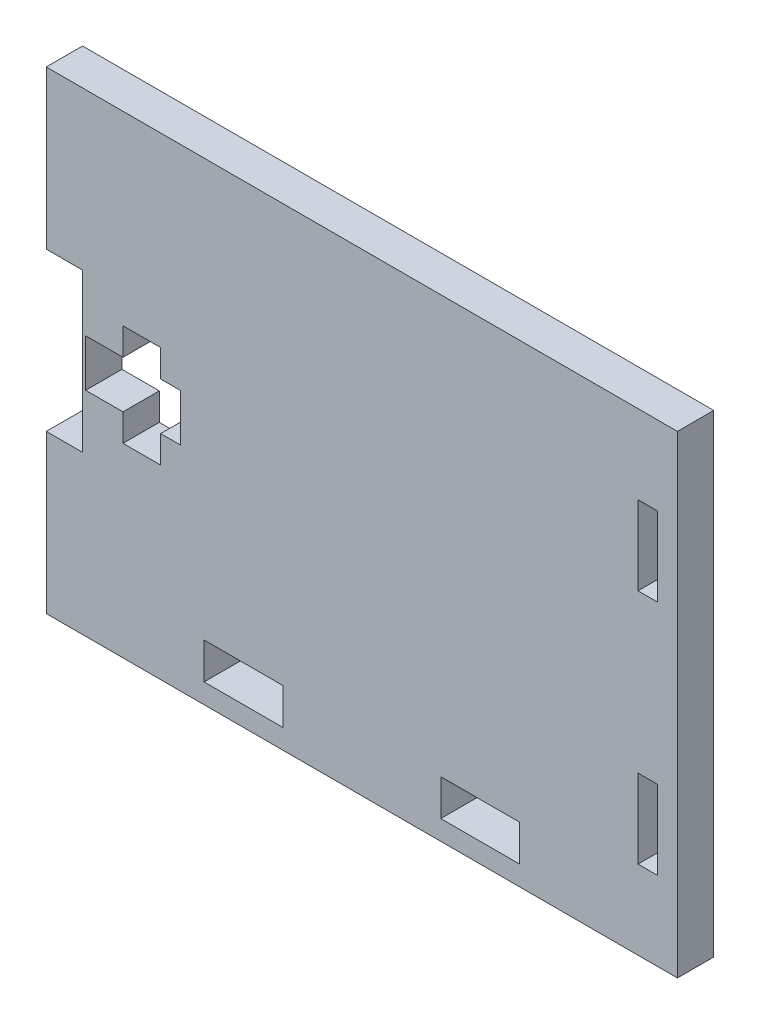
ISO-10303-21;
HEADER;
FILE_DESCRIPTION(('STEP AP214'),'2;1');
FILE_NAME('part.step','',(''),(''),'','','');
FILE_SCHEMA(('AUTOMOTIVE_DESIGN { 1 0 10303 214 1 1 1 1 }'));
ENDSEC;
DATA;
#1=APPLICATION_CONTEXT('core data for automotive mechanical design processes');
#2=APPLICATION_PROTOCOL_DEFINITION('international standard','automotive_design',2000,#1);
#3=PRODUCT_CONTEXT('',#1,'mechanical');
#4=PRODUCT('Part','Part','',(#3));
#5=PRODUCT_RELATED_PRODUCT_CATEGORY('part','',(#4));
#6=PRODUCT_DEFINITION_FORMATION('','',#4);
#7=PRODUCT_DEFINITION_CONTEXT('part definition',#1,'design');
#8=PRODUCT_DEFINITION('design','',#6,#7);
#9=PRODUCT_DEFINITION_SHAPE('','',#8);
#10=(LENGTH_UNIT() NAMED_UNIT(*) SI_UNIT(.MILLI.,.METRE.));
#11=(NAMED_UNIT(*) PLANE_ANGLE_UNIT() SI_UNIT($,.RADIAN.));
#12=(NAMED_UNIT(*) SI_UNIT($,.STERADIAN.) SOLID_ANGLE_UNIT());
#13=UNCERTAINTY_MEASURE_WITH_UNIT(LENGTH_MEASURE(1.E-05),#10,'distance_accuracy_value','');
#14=(GEOMETRIC_REPRESENTATION_CONTEXT(3) GLOBAL_UNCERTAINTY_ASSIGNED_CONTEXT((#13)) GLOBAL_UNIT_ASSIGNED_CONTEXT((#10,
#11,#12)) REPRESENTATION_CONTEXT('',''));
#15=CARTESIAN_POINT('',(0.,0.,0.));
#16=DIRECTION('',(0.,0.,1.));
#17=DIRECTION('',(1.,0.,0.));
#18=AXIS2_PLACEMENT_3D('',#15,#16,#17);
#19=CARTESIAN_POINT('',(0.,0.,-2.921));
#20=DIRECTION('',(0.,0.,-1.));
#21=DIRECTION('',(-1.,0.,0.));
#22=AXIS2_PLACEMENT_3D('',#19,#20,#21);
#23=PLANE('',#22);
#24=DIRECTION('',(0.,1.,0.));
#25=VECTOR('',#24,1.);
#26=CARTESIAN_POINT('',(49.2125,11.1125,-2.921));
#27=LINE('',#26,#25);
#28=CARTESIAN_POINT('',(49.2125,4.7625,-2.921));
#29=VERTEX_POINT('',#28);
#30=CARTESIAN_POINT('',(49.2125,11.1125,-2.921));
#31=VERTEX_POINT('',#30);
#32=EDGE_CURVE('E272',#29,#31,#27,.T.);
#33=ORIENTED_EDGE('',*,*,#32,.T.);
#34=DIRECTION('',(-1.,0.,0.));
#35=VECTOR('',#34,1.);
#36=CARTESIAN_POINT('',(49.2125,11.1125,-2.921));
#37=LINE('',#36,#35);
#38=CARTESIAN_POINT('',(47.625,11.1125,-2.921));
#39=VERTEX_POINT('',#38);
#40=EDGE_CURVE('E281',#31,#39,#37,.T.);
#41=ORIENTED_EDGE('',*,*,#40,.T.);
#42=DIRECTION('',(0.,-1.,0.));
#43=VECTOR('',#42,1.);
#44=CARTESIAN_POINT('',(47.625,11.1125,-2.921));
#45=LINE('',#44,#43);
#46=CARTESIAN_POINT('',(47.625,4.7625,-2.921));
#47=VERTEX_POINT('',#46);
#48=EDGE_CURVE('E52',#39,#47,#45,.T.);
#49=ORIENTED_EDGE('',*,*,#48,.T.);
#50=DIRECTION('',(1.,0.,0.));
#51=VECTOR('',#50,1.);
#52=CARTESIAN_POINT('',(49.2125,4.7625,-2.921));
#53=LINE('',#52,#51);
#54=EDGE_CURVE('E278',#47,#29,#53,.T.);
#55=ORIENTED_EDGE('',*,*,#54,.T.);
#56=EDGE_LOOP('',(#33,#41,#49,#55));
#57=FACE_BOUND('',#56,.T.);
#58=DIRECTION('',(0.,-1.,0.));
#59=VECTOR('',#58,1.);
#60=CARTESIAN_POINT('',(47.625,30.1625,-2.921));
#61=LINE('',#60,#59);
#62=CARTESIAN_POINT('',(47.625,30.1625,-2.921));
#63=VERTEX_POINT('',#62);
#64=CARTESIAN_POINT('',(47.625,23.8125,-2.921));
#65=VERTEX_POINT('',#64);
#66=EDGE_CURVE('E314',#63,#65,#61,.T.);
#67=ORIENTED_EDGE('',*,*,#66,.T.);
#68=DIRECTION('',(1.,0.,0.));
#69=VECTOR('',#68,1.);
#70=CARTESIAN_POINT('',(47.625,23.8125,-2.921));
#71=LINE('',#70,#69);
#72=CARTESIAN_POINT('',(49.2125,23.8125,-2.921));
#73=VERTEX_POINT('',#72);
#74=EDGE_CURVE('E317',#65,#73,#71,.T.);
#75=ORIENTED_EDGE('',*,*,#74,.T.);
#76=DIRECTION('',(0.,1.,0.));
#77=VECTOR('',#76,1.);
#78=CARTESIAN_POINT('',(49.2125,30.1625,-2.921));
#79=LINE('',#78,#77);
#80=CARTESIAN_POINT('',(49.2125,30.1625,-2.921));
#81=VERTEX_POINT('',#80);
#82=EDGE_CURVE('E321',#73,#81,#79,.T.);
#83=ORIENTED_EDGE('',*,*,#82,.T.);
#84=DIRECTION('',(-1.,0.,0.));
#85=VECTOR('',#84,1.);
#86=CARTESIAN_POINT('',(47.625,30.1625,-2.921));
#87=LINE('',#86,#85);
#88=EDGE_CURVE('E324',#81,#63,#87,.T.);
#89=ORIENTED_EDGE('',*,*,#88,.T.);
#90=EDGE_LOOP('',(#67,#75,#83,#89));
#91=FACE_BOUND('',#90,.T.);
#92=DIRECTION('',(0.,1.,0.));
#93=VECTOR('',#92,1.);
#94=CARTESIAN_POINT('',(19.05,0.,-2.921));
#95=LINE('',#94,#93);
#96=CARTESIAN_POINT('',(19.05,0.,-2.921));
#97=VERTEX_POINT('',#96);
#98=CARTESIAN_POINT('',(19.05,2.921,-2.921));
#99=VERTEX_POINT('',#98);
#100=EDGE_CURVE('E553',#97,#99,#95,.T.);
#101=ORIENTED_EDGE('',*,*,#100,.T.);
#102=DIRECTION('',(-1.,0.,0.));
#103=VECTOR('',#102,1.);
#104=CARTESIAN_POINT('',(19.05,2.921,-2.921));
#105=LINE('',#104,#103);
#106=CARTESIAN_POINT('',(12.7,2.921,-2.921));
#107=VERTEX_POINT('',#106);
#108=EDGE_CURVE('E556',#99,#107,#105,.T.);
#109=ORIENTED_EDGE('',*,*,#108,.T.);
#110=DIRECTION('',(0.,-1.,0.));
#111=VECTOR('',#110,1.);
#112=CARTESIAN_POINT('',(12.7,2.921,-2.921));
#113=LINE('',#112,#111);
#114=CARTESIAN_POINT('',(12.7,0.,-2.921));
#115=VERTEX_POINT('',#114);
#116=EDGE_CURVE('E559',#107,#115,#113,.T.);
#117=ORIENTED_EDGE('',*,*,#116,.T.);
#118=DIRECTION('',(1.,0.,0.));
#119=VECTOR('',#118,1.);
#120=CARTESIAN_POINT('',(12.7,0.,-2.921));
#121=LINE('',#120,#119);
#122=EDGE_CURVE('E561',#115,#97,#121,.T.);
#123=ORIENTED_EDGE('',*,*,#122,.T.);
#124=EDGE_LOOP('',(#101,#109,#117,#123));
#125=FACE_BOUND('',#124,.T.);
#126=DIRECTION('',(0.,1.,0.));
#127=VECTOR('',#126,1.);
#128=CARTESIAN_POINT('',(38.1,0.,-2.921));
#129=LINE('',#128,#127);
#130=CARTESIAN_POINT('',(38.1,0.,-2.921));
#131=VERTEX_POINT('',#130);
#132=CARTESIAN_POINT('',(38.1,2.921,-2.921));
#133=VERTEX_POINT('',#132);
#134=EDGE_CURVE('E542',#131,#133,#129,.T.);
#135=ORIENTED_EDGE('',*,*,#134,.T.);
#136=DIRECTION('',(-1.,0.,0.));
#137=VECTOR('',#136,1.);
#138=CARTESIAN_POINT('',(38.1,2.921,-2.921));
#139=LINE('',#138,#137);
#140=CARTESIAN_POINT('',(31.75,2.921,-2.921));
#141=VERTEX_POINT('',#140);
#142=EDGE_CURVE('E632',#133,#141,#139,.T.);
#143=ORIENTED_EDGE('',*,*,#142,.T.);
#144=DIRECTION('',(0.,-1.,0.));
#145=VECTOR('',#144,1.);
#146=CARTESIAN_POINT('',(31.75,2.921,-2.921));
#147=LINE('',#146,#145);
#148=CARTESIAN_POINT('',(31.75,0.,-2.921));
#149=VERTEX_POINT('',#148);
#150=EDGE_CURVE('E635',#141,#149,#147,.T.);
#151=ORIENTED_EDGE('',*,*,#150,.T.);
#152=DIRECTION('',(1.,0.,0.));
#153=VECTOR('',#152,1.);
#154=CARTESIAN_POINT('',(31.75,0.,-2.921));
#155=LINE('',#154,#153);
#156=EDGE_CURVE('E552',#149,#131,#155,.T.);
#157=ORIENTED_EDGE('',*,*,#156,.T.);
#158=EDGE_LOOP('',(#135,#143,#151,#157));
#159=FACE_BOUND('',#158,.T.);
#160=DIRECTION('',(-1.,0.,0.));
#161=VECTOR('',#160,1.);
#162=CARTESIAN_POINT('',(-4.43491996680027,23.8125,-2.921));
#163=LINE('',#162,#161);
#164=CARTESIAN_POINT('',(2.921,23.8125,-2.921));
#165=VERTEX_POINT('',#164);
#166=CARTESIAN_POINT('',(0.,23.8125,-2.921));
#167=VERTEX_POINT('',#166);
#168=EDGE_CURVE('E467',#165,#167,#163,.T.);
#169=ORIENTED_EDGE('',*,*,#168,.T.);
#170=DIRECTION('',(0.,-1.,0.));
#171=VECTOR('',#170,1.);
#172=CARTESIAN_POINT('',(0.,-1.5875,-2.921));
#173=LINE('',#172,#171);
#174=CARTESIAN_POINT('',(0.,36.5125,-2.921));
#175=VERTEX_POINT('',#174);
#176=EDGE_CURVE('E576',#175,#167,#173,.T.);
#177=ORIENTED_EDGE('',*,*,#176,.F.);
#178=DIRECTION('',(-1.,0.,0.));
#179=VECTOR('',#178,1.);
#180=CARTESIAN_POINT('',(0.,36.5125,-2.921));
#181=LINE('',#180,#179);
#182=CARTESIAN_POINT('',(50.8,36.5125,-2.921));
#183=VERTEX_POINT('',#182);
#184=EDGE_CURVE('E490',#183,#175,#181,.T.);
#185=ORIENTED_EDGE('',*,*,#184,.F.);
#186=DIRECTION('',(0.,1.,0.));
#187=VECTOR('',#186,1.);
#188=CARTESIAN_POINT('',(50.8,-1.5875,-2.921));
#189=LINE('',#188,#187);
#190=CARTESIAN_POINT('',(50.8,-1.5875,-2.921));
#191=VERTEX_POINT('',#190);
#192=EDGE_CURVE('E582',#191,#183,#189,.T.);
#193=ORIENTED_EDGE('',*,*,#192,.F.);
#194=DIRECTION('',(1.,0.,0.));
#195=VECTOR('',#194,1.);
#196=CARTESIAN_POINT('',(0.,-1.5875,-2.921));
#197=LINE('',#196,#195);
#198=CARTESIAN_POINT('',(0.,-1.5875,-2.921));
#199=VERTEX_POINT('',#198);
#200=EDGE_CURVE('E579',#199,#191,#197,.T.);
#201=ORIENTED_EDGE('',*,*,#200,.F.);
#202=CARTESIAN_POINT('',(0.,11.1125,-2.921));
#203=VERTEX_POINT('',#202);
#204=EDGE_CURVE('E580',#203,#199,#173,.T.);
#205=ORIENTED_EDGE('',*,*,#204,.F.);
#206=DIRECTION('',(1.,0.,0.));
#207=VECTOR('',#206,1.);
#208=CARTESIAN_POINT('',(2.921,11.1125,-2.921));
#209=LINE('',#208,#207);
#210=CARTESIAN_POINT('',(2.921,11.1125,-2.921));
#211=VERTEX_POINT('',#210);
#212=EDGE_CURVE('E460',#203,#211,#209,.T.);
#213=ORIENTED_EDGE('',*,*,#212,.T.);
#214=DIRECTION('',(0.,1.,0.));
#215=VECTOR('',#214,1.);
#216=CARTESIAN_POINT('',(2.921,23.8125,-2.921));
#217=LINE('',#216,#215);
#218=EDGE_CURVE('E463',#211,#165,#217,.T.);
#219=ORIENTED_EDGE('',*,*,#218,.T.);
#220=EDGE_LOOP('',(#169,#177,#185,#193,#201,#205,#213,#219));
#221=FACE_BOUND('',#220,.T.);
#222=DIRECTION('',(0.,-1.,0.));
#223=VECTOR('',#222,1.);
#224=CARTESIAN_POINT('',(10.795,19.36115,-2.921));
#225=LINE('',#224,#223);
#226=CARTESIAN_POINT('',(10.795,19.36115,-2.921));
#227=VERTEX_POINT('',#226);
#228=CARTESIAN_POINT('',(10.795,15.56385,-2.921));
#229=VERTEX_POINT('',#228);
#230=EDGE_CURVE('E354',#227,#229,#225,.T.);
#231=ORIENTED_EDGE('',*,*,#230,.F.);
#232=DIRECTION('',(1.,0.,0.));
#233=VECTOR('',#232,1.);
#234=CARTESIAN_POINT('',(9.2075,19.36115,-2.921));
#235=LINE('',#234,#233);
#236=CARTESIAN_POINT('',(9.2075,19.36115,-2.921));
#237=VERTEX_POINT('',#236);
#238=EDGE_CURVE('E352',#237,#227,#235,.T.);
#239=ORIENTED_EDGE('',*,*,#238,.F.);
#240=DIRECTION('',(0.,-1.,0.));
#241=VECTOR('',#240,1.);
#242=CARTESIAN_POINT('',(9.2075,21.55825,-2.921));
#243=LINE('',#242,#241);
#244=CARTESIAN_POINT('',(9.2075,21.55825,-2.921));
#245=VERTEX_POINT('',#244);
#246=EDGE_CURVE('E376',#245,#237,#243,.T.);
#247=ORIENTED_EDGE('',*,*,#246,.F.);
#248=DIRECTION('',(1.,0.,0.));
#249=VECTOR('',#248,1.);
#250=CARTESIAN_POINT('',(6.175375,21.55825,-2.921));
#251=LINE('',#250,#249);
#252=CARTESIAN_POINT('',(6.175375,21.55825,-2.921));
#253=VERTEX_POINT('',#252);
#254=EDGE_CURVE('E373',#253,#245,#251,.T.);
#255=ORIENTED_EDGE('',*,*,#254,.F.);
#256=DIRECTION('',(0.,1.,0.));
#257=VECTOR('',#256,1.);
#258=CARTESIAN_POINT('',(6.175375,19.36115,-2.921));
#259=LINE('',#258,#257);
#260=CARTESIAN_POINT('',(6.175375,19.36115,-2.921));
#261=VERTEX_POINT('',#260);
#262=EDGE_CURVE('E371',#261,#253,#259,.T.);
#263=ORIENTED_EDGE('',*,*,#262,.F.);
#264=DIRECTION('',(1.,0.,0.));
#265=VECTOR('',#264,1.);
#266=CARTESIAN_POINT('',(3.175,19.36115,-2.921));
#267=LINE('',#266,#265);
#268=CARTESIAN_POINT('',(3.175,19.36115,-2.921));
#269=VERTEX_POINT('',#268);
#270=EDGE_CURVE('E369',#269,#261,#267,.T.);
#271=ORIENTED_EDGE('',*,*,#270,.F.);
#272=DIRECTION('',(0.,1.,0.));
#273=VECTOR('',#272,1.);
#274=CARTESIAN_POINT('',(3.175,15.56385,-2.921));
#275=LINE('',#274,#273);
#276=CARTESIAN_POINT('',(3.175,15.56385,-2.921));
#277=VERTEX_POINT('',#276);
#278=EDGE_CURVE('E367',#277,#269,#275,.T.);
#279=ORIENTED_EDGE('',*,*,#278,.F.);
#280=DIRECTION('',(-1.,0.,0.));
#281=VECTOR('',#280,1.);
#282=CARTESIAN_POINT('',(6.175375,15.56385,-2.921));
#283=LINE('',#282,#281);
#284=CARTESIAN_POINT('',(6.175375,15.56385,-2.921));
#285=VERTEX_POINT('',#284);
#286=EDGE_CURVE('E365',#285,#277,#283,.T.);
#287=ORIENTED_EDGE('',*,*,#286,.F.);
#288=DIRECTION('',(0.,1.,0.));
#289=VECTOR('',#288,1.);
#290=CARTESIAN_POINT('',(6.175375,13.36675,-2.921));
#291=LINE('',#290,#289);
#292=CARTESIAN_POINT('',(6.175375,13.36675,-2.921));
#293=VERTEX_POINT('',#292);
#294=EDGE_CURVE('E363',#293,#285,#291,.T.);
#295=ORIENTED_EDGE('',*,*,#294,.F.);
#296=DIRECTION('',(-1.,0.,0.));
#297=VECTOR('',#296,1.);
#298=CARTESIAN_POINT('',(9.2075,13.36675,-2.921));
#299=LINE('',#298,#297);
#300=CARTESIAN_POINT('',(9.2075,13.36675,-2.921));
#301=VERTEX_POINT('',#300);
#302=EDGE_CURVE('E361',#301,#293,#299,.T.);
#303=ORIENTED_EDGE('',*,*,#302,.F.);
#304=DIRECTION('',(0.,-1.,0.));
#305=VECTOR('',#304,1.);
#306=CARTESIAN_POINT('',(9.2075,15.56385,-2.921));
#307=LINE('',#306,#305);
#308=CARTESIAN_POINT('',(9.2075,15.56385,-2.921));
#309=VERTEX_POINT('',#308);
#310=EDGE_CURVE('E359',#309,#301,#307,.T.);
#311=ORIENTED_EDGE('',*,*,#310,.F.);
#312=DIRECTION('',(-1.,0.,0.));
#313=VECTOR('',#312,1.);
#314=CARTESIAN_POINT('',(10.795,15.56385,-2.921));
#315=LINE('',#314,#313);
#316=EDGE_CURVE('E357',#229,#309,#315,.T.);
#317=ORIENTED_EDGE('',*,*,#316,.F.);
#318=EDGE_LOOP('',(#231,#239,#247,#255,#263,#271,#279,#287,#295,#303,#311,#317));
#319=FACE_BOUND('',#318,.T.);
#320=ADVANCED_FACE('F36',(#57,#91,#125,#159,#221,#319),#23,.T.);
#321=CARTESIAN_POINT('',(0.,0.,0.));
#322=DIRECTION('',(0.,0.,-1.));
#323=DIRECTION('',(-1.,0.,0.));
#324=AXIS2_PLACEMENT_3D('',#321,#322,#323);
#325=PLANE('',#324);
#326=DIRECTION('',(-1.,0.,0.));
#327=VECTOR('',#326,1.);
#328=CARTESIAN_POINT('',(49.2125,11.1125,0.));
#329=LINE('',#328,#327);
#330=CARTESIAN_POINT('',(49.2125,11.1125,0.));
#331=VERTEX_POINT('',#330);
#332=CARTESIAN_POINT('',(47.625,11.1125,0.));
#333=VERTEX_POINT('',#332);
#334=EDGE_CURVE('E297',#331,#333,#329,.T.);
#335=ORIENTED_EDGE('',*,*,#334,.F.);
#336=DIRECTION('',(0.,1.,0.));
#337=VECTOR('',#336,1.);
#338=CARTESIAN_POINT('',(49.2125,11.1125,0.));
#339=LINE('',#338,#337);
#340=CARTESIAN_POINT('',(49.2125,4.7625,0.));
#341=VERTEX_POINT('',#340);
#342=EDGE_CURVE('E60',#341,#331,#339,.T.);
#343=ORIENTED_EDGE('',*,*,#342,.F.);
#344=DIRECTION('',(1.,0.,0.));
#345=VECTOR('',#344,1.);
#346=CARTESIAN_POINT('',(49.2125,4.7625,0.));
#347=LINE('',#346,#345);
#348=CARTESIAN_POINT('',(47.625,4.7625,0.));
#349=VERTEX_POINT('',#348);
#350=EDGE_CURVE('E287',#349,#341,#347,.T.);
#351=ORIENTED_EDGE('',*,*,#350,.F.);
#352=DIRECTION('',(0.,-1.,0.));
#353=VECTOR('',#352,1.);
#354=CARTESIAN_POINT('',(47.625,11.1125,0.));
#355=LINE('',#354,#353);
#356=EDGE_CURVE('E290',#333,#349,#355,.T.);
#357=ORIENTED_EDGE('',*,*,#356,.F.);
#358=EDGE_LOOP('',(#335,#343,#351,#357));
#359=FACE_BOUND('',#358,.T.);
#360=DIRECTION('',(1.,0.,0.));
#361=VECTOR('',#360,1.);
#362=CARTESIAN_POINT('',(47.625,23.8125,0.));
#363=LINE('',#362,#361);
#364=CARTESIAN_POINT('',(47.625,23.8125,0.));
#365=VERTEX_POINT('',#364);
#366=CARTESIAN_POINT('',(49.2125,23.8125,0.));
#367=VERTEX_POINT('',#366);
#368=EDGE_CURVE('E330',#365,#367,#363,.T.);
#369=ORIENTED_EDGE('',*,*,#368,.F.);
#370=DIRECTION('',(0.,-1.,0.));
#371=VECTOR('',#370,1.);
#372=CARTESIAN_POINT('',(47.625,30.1625,0.));
#373=LINE('',#372,#371);
#374=CARTESIAN_POINT('',(47.625,30.1625,0.));
#375=VERTEX_POINT('',#374);
#376=EDGE_CURVE('E310',#375,#365,#373,.T.);
#377=ORIENTED_EDGE('',*,*,#376,.F.);
#378=DIRECTION('',(-1.,0.,0.));
#379=VECTOR('',#378,1.);
#380=CARTESIAN_POINT('',(47.625,30.1625,0.));
#381=LINE('',#380,#379);
#382=CARTESIAN_POINT('',(49.2125,30.1625,0.));
#383=VERTEX_POINT('',#382);
#384=EDGE_CURVE('E318',#383,#375,#381,.T.);
#385=ORIENTED_EDGE('',*,*,#384,.F.);
#386=DIRECTION('',(0.,1.,0.));
#387=VECTOR('',#386,1.);
#388=CARTESIAN_POINT('',(49.2125,30.1625,0.));
#389=LINE('',#388,#387);
#390=EDGE_CURVE('E341',#367,#383,#389,.T.);
#391=ORIENTED_EDGE('',*,*,#390,.F.);
#392=EDGE_LOOP('',(#369,#377,#385,#391));
#393=FACE_BOUND('',#392,.T.);
#394=DIRECTION('',(0.,-1.,0.));
#395=VECTOR('',#394,1.);
#396=CARTESIAN_POINT('',(0.,-1.5875,0.));
#397=LINE('',#396,#395);
#398=CARTESIAN_POINT('',(0.,36.5125,0.));
#399=VERTEX_POINT('',#398);
#400=CARTESIAN_POINT('',(0.,23.8125,0.));
#401=VERTEX_POINT('',#400);
#402=EDGE_CURVE('E484',#399,#401,#397,.T.);
#403=ORIENTED_EDGE('',*,*,#402,.T.);
#404=DIRECTION('',(-1.,0.,0.));
#405=VECTOR('',#404,1.);
#406=CARTESIAN_POINT('',(-4.43491996680027,23.8125,0.));
#407=LINE('',#406,#405);
#408=CARTESIAN_POINT('',(2.921,23.8125,0.));
#409=VERTEX_POINT('',#408);
#410=EDGE_CURVE('E464',#409,#401,#407,.T.);
#411=ORIENTED_EDGE('',*,*,#410,.F.);
#412=DIRECTION('',(0.,1.,0.));
#413=VECTOR('',#412,1.);
#414=CARTESIAN_POINT('',(2.921,23.8125,0.));
#415=LINE('',#414,#413);
#416=CARTESIAN_POINT('',(2.921,11.1125,0.));
#417=VERTEX_POINT('',#416);
#418=EDGE_CURVE('E459',#417,#409,#415,.T.);
#419=ORIENTED_EDGE('',*,*,#418,.F.);
#420=DIRECTION('',(-1.,0.,0.));
#421=VECTOR('',#420,1.);
#422=CARTESIAN_POINT('',(0.,11.1125,0.));
#423=LINE('',#422,#421);
#424=CARTESIAN_POINT('',(0.,11.1125,0.));
#425=VERTEX_POINT('',#424);
#426=EDGE_CURVE('E12',#417,#425,#423,.T.);
#427=ORIENTED_EDGE('',*,*,#426,.T.);
#428=CARTESIAN_POINT('',(0.,-1.5875,0.));
#429=VERTEX_POINT('',#428);
#430=EDGE_CURVE('E489',#425,#429,#397,.T.);
#431=ORIENTED_EDGE('',*,*,#430,.T.);
#432=DIRECTION('',(1.,0.,0.));
#433=VECTOR('',#432,1.);
#434=CARTESIAN_POINT('',(0.,-1.5875,0.));
#435=LINE('',#434,#433);
#436=CARTESIAN_POINT('',(50.8,-1.5875,0.));
#437=VERTEX_POINT('',#436);
#438=EDGE_CURVE('E488',#429,#437,#435,.T.);
#439=ORIENTED_EDGE('',*,*,#438,.T.);
#440=DIRECTION('',(0.,1.,0.));
#441=VECTOR('',#440,1.);
#442=CARTESIAN_POINT('',(50.8,-1.5875,0.));
#443=LINE('',#442,#441);
#444=CARTESIAN_POINT('',(50.8,36.5125,0.));
#445=VERTEX_POINT('',#444);
#446=EDGE_CURVE('E496',#437,#445,#443,.T.);
#447=ORIENTED_EDGE('',*,*,#446,.T.);
#448=DIRECTION('',(-1.,0.,0.));
#449=VECTOR('',#448,1.);
#450=CARTESIAN_POINT('',(0.,36.5125,0.));
#451=LINE('',#450,#449);
#452=EDGE_CURVE('E500',#445,#399,#451,.T.);
#453=ORIENTED_EDGE('',*,*,#452,.T.);
#454=EDGE_LOOP('',(#403,#411,#419,#427,#431,#439,#447,#453));
#455=FACE_BOUND('',#454,.T.);
#456=DIRECTION('',(-1.,0.,0.));
#457=VECTOR('',#456,1.);
#458=CARTESIAN_POINT('',(19.05,2.921,0.));
#459=LINE('',#458,#457);
#460=CARTESIAN_POINT('',(19.05,2.921,0.));
#461=VERTEX_POINT('',#460);
#462=CARTESIAN_POINT('',(12.7,2.921,0.));
#463=VERTEX_POINT('',#462);
#464=EDGE_CURVE('E509',#461,#463,#459,.T.);
#465=ORIENTED_EDGE('',*,*,#464,.F.);
#466=DIRECTION('',(0.,1.,0.));
#467=VECTOR('',#466,1.);
#468=CARTESIAN_POINT('',(19.05,0.,0.));
#469=LINE('',#468,#467);
#470=CARTESIAN_POINT('',(19.05,0.,0.));
#471=VERTEX_POINT('',#470);
#472=EDGE_CURVE('E514',#471,#461,#469,.T.);
#473=ORIENTED_EDGE('',*,*,#472,.F.);
#474=DIRECTION('',(1.,0.,0.));
#475=VECTOR('',#474,1.);
#476=CARTESIAN_POINT('',(12.7,0.,0.));
#477=LINE('',#476,#475);
#478=CARTESIAN_POINT('',(12.7,0.,0.));
#479=VERTEX_POINT('',#478);
#480=EDGE_CURVE('E520',#479,#471,#477,.T.);
#481=ORIENTED_EDGE('',*,*,#480,.F.);
#482=DIRECTION('',(0.,-1.,0.));
#483=VECTOR('',#482,1.);
#484=CARTESIAN_POINT('',(12.7,2.921,0.));
#485=LINE('',#484,#483);
#486=EDGE_CURVE('E513',#463,#479,#485,.T.);
#487=ORIENTED_EDGE('',*,*,#486,.F.);
#488=EDGE_LOOP('',(#465,#473,#481,#487));
#489=FACE_BOUND('',#488,.T.);
#490=DIRECTION('',(-1.,0.,0.));
#491=VECTOR('',#490,1.);
#492=CARTESIAN_POINT('',(38.1,2.921,0.));
#493=LINE('',#492,#491);
#494=CARTESIAN_POINT('',(38.1,2.921,0.));
#495=VERTEX_POINT('',#494);
#496=CARTESIAN_POINT('',(31.75,2.921,0.));
#497=VERTEX_POINT('',#496);
#498=EDGE_CURVE('E528',#495,#497,#493,.T.);
#499=ORIENTED_EDGE('',*,*,#498,.F.);
#500=DIRECTION('',(0.,1.,0.));
#501=VECTOR('',#500,1.);
#502=CARTESIAN_POINT('',(38.1,0.,0.));
#503=LINE('',#502,#501);
#504=CARTESIAN_POINT('',(38.1,0.,0.));
#505=VERTEX_POINT('',#504);
#506=EDGE_CURVE('E532',#505,#495,#503,.T.);
#507=ORIENTED_EDGE('',*,*,#506,.F.);
#508=DIRECTION('',(1.,0.,0.));
#509=VECTOR('',#508,1.);
#510=CARTESIAN_POINT('',(31.75,0.,0.));
#511=LINE('',#510,#509);
#512=CARTESIAN_POINT('',(31.75,0.,0.));
#513=VERTEX_POINT('',#512);
#514=EDGE_CURVE('E538',#513,#505,#511,.T.);
#515=ORIENTED_EDGE('',*,*,#514,.F.);
#516=DIRECTION('',(0.,-1.,0.));
#517=VECTOR('',#516,1.);
#518=CARTESIAN_POINT('',(31.75,2.921,0.));
#519=LINE('',#518,#517);
#520=EDGE_CURVE('E531',#497,#513,#519,.T.);
#521=ORIENTED_EDGE('',*,*,#520,.F.);
#522=EDGE_LOOP('',(#499,#507,#515,#521));
#523=FACE_BOUND('',#522,.T.);
#524=DIRECTION('',(1.,0.,0.));
#525=VECTOR('',#524,1.);
#526=CARTESIAN_POINT('',(9.2075,19.36115,0.));
#527=LINE('',#526,#525);
#528=CARTESIAN_POINT('',(9.2075,19.36115,0.));
#529=VERTEX_POINT('',#528);
#530=CARTESIAN_POINT('',(10.795,19.36115,0.));
#531=VERTEX_POINT('',#530);
#532=EDGE_CURVE('E345',#529,#531,#527,.T.);
#533=ORIENTED_EDGE('',*,*,#532,.T.);
#534=DIRECTION('',(0.,-1.,0.));
#535=VECTOR('',#534,1.);
#536=CARTESIAN_POINT('',(10.795,19.36115,0.));
#537=LINE('',#536,#535);
#538=CARTESIAN_POINT('',(10.795,15.56385,0.));
#539=VERTEX_POINT('',#538);
#540=EDGE_CURVE('E382',#531,#539,#537,.T.);
#541=ORIENTED_EDGE('',*,*,#540,.T.);
#542=DIRECTION('',(-1.,0.,0.));
#543=VECTOR('',#542,1.);
#544=CARTESIAN_POINT('',(10.795,15.56385,0.));
#545=LINE('',#544,#543);
#546=CARTESIAN_POINT('',(9.2075,15.56385,0.));
#547=VERTEX_POINT('',#546);
#548=EDGE_CURVE('E394',#539,#547,#545,.T.);
#549=ORIENTED_EDGE('',*,*,#548,.T.);
#550=DIRECTION('',(0.,-1.,0.));
#551=VECTOR('',#550,1.);
#552=CARTESIAN_POINT('',(9.2075,15.56385,0.));
#553=LINE('',#552,#551);
#554=CARTESIAN_POINT('',(9.2075,13.36675,0.));
#555=VERTEX_POINT('',#554);
#556=EDGE_CURVE('E397',#547,#555,#553,.T.);
#557=ORIENTED_EDGE('',*,*,#556,.T.);
#558=DIRECTION('',(-1.,0.,0.));
#559=VECTOR('',#558,1.);
#560=CARTESIAN_POINT('',(9.2075,13.36675,0.));
#561=LINE('',#560,#559);
#562=CARTESIAN_POINT('',(6.175375,13.36675,0.));
#563=VERTEX_POINT('',#562);
#564=EDGE_CURVE('E401',#555,#563,#561,.T.);
#565=ORIENTED_EDGE('',*,*,#564,.T.);
#566=DIRECTION('',(0.,1.,0.));
#567=VECTOR('',#566,1.);
#568=CARTESIAN_POINT('',(6.175375,13.36675,0.));
#569=LINE('',#568,#567);
#570=CARTESIAN_POINT('',(6.175375,15.56385,0.));
#571=VERTEX_POINT('',#570);
#572=EDGE_CURVE('E405',#563,#571,#569,.T.);
#573=ORIENTED_EDGE('',*,*,#572,.T.);
#574=DIRECTION('',(-1.,0.,0.));
#575=VECTOR('',#574,1.);
#576=CARTESIAN_POINT('',(6.175375,15.56385,0.));
#577=LINE('',#576,#575);
#578=CARTESIAN_POINT('',(3.175,15.56385,0.));
#579=VERTEX_POINT('',#578);
#580=EDGE_CURVE('E413',#571,#579,#577,.T.);
#581=ORIENTED_EDGE('',*,*,#580,.T.);
#582=DIRECTION('',(0.,1.,0.));
#583=VECTOR('',#582,1.);
#584=CARTESIAN_POINT('',(3.175,15.56385,0.));
#585=LINE('',#584,#583);
#586=CARTESIAN_POINT('',(3.175,19.36115,0.));
#587=VERTEX_POINT('',#586);
#588=EDGE_CURVE('E416',#579,#587,#585,.T.);
#589=ORIENTED_EDGE('',*,*,#588,.T.);
#590=DIRECTION('',(1.,0.,0.));
#591=VECTOR('',#590,1.);
#592=CARTESIAN_POINT('',(3.175,19.36115,0.));
#593=LINE('',#592,#591);
#594=CARTESIAN_POINT('',(6.175375,19.36115,0.));
#595=VERTEX_POINT('',#594);
#596=EDGE_CURVE('E420',#587,#595,#593,.T.);
#597=ORIENTED_EDGE('',*,*,#596,.T.);
#598=DIRECTION('',(0.,1.,0.));
#599=VECTOR('',#598,1.);
#600=CARTESIAN_POINT('',(6.175375,19.36115,0.));
#601=LINE('',#600,#599);
#602=CARTESIAN_POINT('',(6.175375,21.55825,0.));
#603=VERTEX_POINT('',#602);
#604=EDGE_CURVE('E424',#595,#603,#601,.T.);
#605=ORIENTED_EDGE('',*,*,#604,.T.);
#606=DIRECTION('',(1.,0.,0.));
#607=VECTOR('',#606,1.);
#608=CARTESIAN_POINT('',(6.175375,21.55825,0.));
#609=LINE('',#608,#607);
#610=CARTESIAN_POINT('',(9.2075,21.55825,0.));
#611=VERTEX_POINT('',#610);
#612=EDGE_CURVE('E428',#603,#611,#609,.T.);
#613=ORIENTED_EDGE('',*,*,#612,.T.);
#614=DIRECTION('',(0.,-1.,0.));
#615=VECTOR('',#614,1.);
#616=CARTESIAN_POINT('',(9.2075,21.55825,0.));
#617=LINE('',#616,#615);
#618=EDGE_CURVE('E355',#611,#529,#617,.T.);
#619=ORIENTED_EDGE('',*,*,#618,.T.);
#620=EDGE_LOOP('',(#533,#541,#549,#557,#565,#573,#581,#589,#597,#605,#613,#619));
#621=FACE_BOUND('',#620,.T.);
#622=ADVANCED_FACE('F610',(#359,#393,#455,#489,#523,#621),#325,.F.);
#623=CARTESIAN_POINT('',(0.,-1.5875,-2.921));
#624=DIRECTION('',(-1.,0.,0.));
#625=DIRECTION('',(0.,0.,1.));
#626=AXIS2_PLACEMENT_3D('',#623,#624,#625);
#627=PLANE('',#626);
#628=DIRECTION('',(0.,0.,-1.));
#629=VECTOR('',#628,1.);
#630=CARTESIAN_POINT('',(0.,23.8125,-2.921));
#631=LINE('',#630,#629);
#632=EDGE_CURVE('E607',#401,#167,#631,.T.);
#633=ORIENTED_EDGE('',*,*,#632,.F.);
#634=ORIENTED_EDGE('',*,*,#402,.F.);
#635=DIRECTION('',(0.,0.,1.));
#636=VECTOR('',#635,1.);
#637=CARTESIAN_POINT('',(0.,36.5125,-2.921));
#638=LINE('',#637,#636);
#639=EDGE_CURVE('E45',#175,#399,#638,.T.);
#640=ORIENTED_EDGE('',*,*,#639,.F.);
#641=ORIENTED_EDGE('',*,*,#176,.T.);
#642=EDGE_LOOP('',(#633,#634,#640,#641));
#643=FACE_BOUND('',#642,.T.);
#644=ADVANCED_FACE('F606',(#643),#627,.T.);
#645=DIRECTION('',(0.,0.,1.));
#646=VECTOR('',#645,1.);
#647=CARTESIAN_POINT('',(0.,11.1125,-2.921));
#648=LINE('',#647,#646);
#649=EDGE_CURVE('E615',#203,#425,#648,.T.);
#650=ORIENTED_EDGE('',*,*,#649,.F.);
#651=ORIENTED_EDGE('',*,*,#204,.T.);
#652=DIRECTION('',(0.,0.,1.));
#653=VECTOR('',#652,1.);
#654=CARTESIAN_POINT('',(0.,-1.5875,-2.921));
#655=LINE('',#654,#653);
#656=EDGE_CURVE('E588',#199,#429,#655,.T.);
#657=ORIENTED_EDGE('',*,*,#656,.T.);
#658=ORIENTED_EDGE('',*,*,#430,.F.);
#659=EDGE_LOOP('',(#650,#651,#657,#658));
#660=FACE_BOUND('',#659,.T.);
#661=ADVANCED_FACE('F38',(#660),#627,.T.);
#662=CARTESIAN_POINT('',(0.,36.5125,-2.921));
#663=DIRECTION('',(0.,1.,0.));
#664=DIRECTION('',(0.,0.,1.));
#665=AXIS2_PLACEMENT_3D('',#662,#663,#664);
#666=PLANE('',#665);
#667=ORIENTED_EDGE('',*,*,#452,.F.);
#668=DIRECTION('',(0.,0.,1.));
#669=VECTOR('',#668,1.);
#670=CARTESIAN_POINT('',(50.8,36.5125,-2.921));
#671=LINE('',#670,#669);
#672=EDGE_CURVE('E596',#183,#445,#671,.T.);
#673=ORIENTED_EDGE('',*,*,#672,.F.);
#674=ORIENTED_EDGE('',*,*,#184,.T.);
#675=ORIENTED_EDGE('',*,*,#639,.T.);
#676=EDGE_LOOP('',(#667,#673,#674,#675));
#677=FACE_BOUND('',#676,.T.);
#678=ADVANCED_FACE('F601',(#677),#666,.T.);
#679=CARTESIAN_POINT('',(50.8,-1.5875,-2.921));
#680=DIRECTION('',(1.,0.,0.));
#681=DIRECTION('',(0.,0.,-1.));
#682=AXIS2_PLACEMENT_3D('',#679,#680,#681);
#683=PLANE('',#682);
#684=ORIENTED_EDGE('',*,*,#446,.F.);
#685=DIRECTION('',(0.,0.,1.));
#686=VECTOR('',#685,1.);
#687=CARTESIAN_POINT('',(50.8,-1.5875,-2.921));
#688=LINE('',#687,#686);
#689=EDGE_CURVE('E591',#191,#437,#688,.T.);
#690=ORIENTED_EDGE('',*,*,#689,.F.);
#691=ORIENTED_EDGE('',*,*,#192,.T.);
#692=ORIENTED_EDGE('',*,*,#672,.T.);
#693=EDGE_LOOP('',(#684,#690,#691,#692));
#694=FACE_BOUND('',#693,.T.);
#695=ADVANCED_FACE('F739',(#694),#683,.T.);
#696=CARTESIAN_POINT('',(0.,-1.5875,-2.921));
#697=DIRECTION('',(0.,-1.,0.));
#698=DIRECTION('',(0.,0.,-1.));
#699=AXIS2_PLACEMENT_3D('',#696,#697,#698);
#700=PLANE('',#699);
#701=ORIENTED_EDGE('',*,*,#438,.F.);
#702=ORIENTED_EDGE('',*,*,#656,.F.);
#703=ORIENTED_EDGE('',*,*,#200,.T.);
#704=ORIENTED_EDGE('',*,*,#689,.T.);
#705=EDGE_LOOP('',(#701,#702,#703,#704));
#706=FACE_BOUND('',#705,.T.);
#707=ADVANCED_FACE('F619',(#706),#700,.T.);
#708=CARTESIAN_POINT('',(19.05,0.,-2.921));
#709=DIRECTION('',(1.,0.,0.));
#710=DIRECTION('',(0.,1.,0.));
#711=AXIS2_PLACEMENT_3D('',#708,#709,#710);
#712=PLANE('',#711);
#713=ORIENTED_EDGE('',*,*,#472,.T.);
#714=DIRECTION('',(0.,0.,1.));
#715=VECTOR('',#714,1.);
#716=CARTESIAN_POINT('',(19.05,2.921,-2.921));
#717=LINE('',#716,#715);
#718=EDGE_CURVE('E563',#99,#461,#717,.T.);
#719=ORIENTED_EDGE('',*,*,#718,.F.);
#720=ORIENTED_EDGE('',*,*,#100,.F.);
#721=DIRECTION('',(0.,0.,1.));
#722=VECTOR('',#721,1.);
#723=CARTESIAN_POINT('',(19.05,0.,-2.921));
#724=LINE('',#723,#722);
#725=EDGE_CURVE('E755',#97,#471,#724,.T.);
#726=ORIENTED_EDGE('',*,*,#725,.T.);
#727=EDGE_LOOP('',(#713,#719,#720,#726));
#728=FACE_BOUND('',#727,.T.);
#729=ADVANCED_FACE('F734',(#728),#712,.F.);
#730=CARTESIAN_POINT('',(12.7,0.,-2.921));
#731=DIRECTION('',(0.,-1.,0.));
#732=DIRECTION('',(0.,0.,-1.));
#733=AXIS2_PLACEMENT_3D('',#730,#731,#732);
#734=PLANE('',#733);
#735=ORIENTED_EDGE('',*,*,#480,.T.);
#736=ORIENTED_EDGE('',*,*,#725,.F.);
#737=ORIENTED_EDGE('',*,*,#122,.F.);
#738=DIRECTION('',(0.,0.,1.));
#739=VECTOR('',#738,1.);
#740=CARTESIAN_POINT('',(12.7,0.,-2.921));
#741=LINE('',#740,#739);
#742=EDGE_CURVE('E572',#115,#479,#741,.T.);
#743=ORIENTED_EDGE('',*,*,#742,.T.);
#744=EDGE_LOOP('',(#735,#736,#737,#743));
#745=FACE_BOUND('',#744,.T.);
#746=ADVANCED_FACE('F745',(#745),#734,.F.);
#747=CARTESIAN_POINT('',(12.7,2.921,-2.921));
#748=DIRECTION('',(-1.,0.,0.));
#749=DIRECTION('',(0.,0.,1.));
#750=AXIS2_PLACEMENT_3D('',#747,#748,#749);
#751=PLANE('',#750);
#752=ORIENTED_EDGE('',*,*,#486,.T.);
#753=ORIENTED_EDGE('',*,*,#742,.F.);
#754=ORIENTED_EDGE('',*,*,#116,.F.);
#755=DIRECTION('',(0.,0.,1.));
#756=VECTOR('',#755,1.);
#757=CARTESIAN_POINT('',(12.7,2.921,-2.921));
#758=LINE('',#757,#756);
#759=EDGE_CURVE('E567',#107,#463,#758,.T.);
#760=ORIENTED_EDGE('',*,*,#759,.T.);
#761=EDGE_LOOP('',(#752,#753,#754,#760));
#762=FACE_BOUND('',#761,.T.);
#763=ADVANCED_FACE('F750',(#762),#751,.F.);
#764=CARTESIAN_POINT('',(19.05,2.921,-2.921));
#765=DIRECTION('',(0.,1.,0.));
#766=DIRECTION('',(0.,0.,1.));
#767=AXIS2_PLACEMENT_3D('',#764,#765,#766);
#768=PLANE('',#767);
#769=ORIENTED_EDGE('',*,*,#464,.T.);
#770=ORIENTED_EDGE('',*,*,#759,.F.);
#771=ORIENTED_EDGE('',*,*,#108,.F.);
#772=ORIENTED_EDGE('',*,*,#718,.T.);
#773=EDGE_LOOP('',(#769,#770,#771,#772));
#774=FACE_BOUND('',#773,.T.);
#775=ADVANCED_FACE('F760',(#774),#768,.F.);
#776=CARTESIAN_POINT('',(38.1,0.,-2.921));
#777=DIRECTION('',(1.,0.,0.));
#778=DIRECTION('',(0.,1.,0.));
#779=AXIS2_PLACEMENT_3D('',#776,#777,#778);
#780=PLANE('',#779);
#781=ORIENTED_EDGE('',*,*,#506,.T.);
#782=DIRECTION('',(0.,0.,1.));
#783=VECTOR('',#782,1.);
#784=CARTESIAN_POINT('',(38.1,2.921,-2.921));
#785=LINE('',#784,#783);
#786=EDGE_CURVE('E549',#133,#495,#785,.T.);
#787=ORIENTED_EDGE('',*,*,#786,.F.);
#788=ORIENTED_EDGE('',*,*,#134,.F.);
#789=DIRECTION('',(0.,0.,1.));
#790=VECTOR('',#789,1.);
#791=CARTESIAN_POINT('',(38.1,0.,-2.921));
#792=LINE('',#791,#790);
#793=EDGE_CURVE('E543',#131,#505,#792,.T.);
#794=ORIENTED_EDGE('',*,*,#793,.T.);
#795=EDGE_LOOP('',(#781,#787,#788,#794));
#796=FACE_BOUND('',#795,.T.);
#797=ADVANCED_FACE('F646',(#796),#780,.F.);
#798=CARTESIAN_POINT('',(31.75,0.,-2.921));
#799=DIRECTION('',(0.,-1.,0.));
#800=DIRECTION('',(0.,0.,-1.));
#801=AXIS2_PLACEMENT_3D('',#798,#799,#800);
#802=PLANE('',#801);
#803=ORIENTED_EDGE('',*,*,#514,.T.);
#804=ORIENTED_EDGE('',*,*,#793,.F.);
#805=ORIENTED_EDGE('',*,*,#156,.F.);
#806=DIRECTION('',(0.,0.,1.));
#807=VECTOR('',#806,1.);
#808=CARTESIAN_POINT('',(31.75,0.,-2.921));
#809=LINE('',#808,#807);
#810=EDGE_CURVE('E545',#149,#513,#809,.T.);
#811=ORIENTED_EDGE('',*,*,#810,.T.);
#812=EDGE_LOOP('',(#803,#804,#805,#811));
#813=FACE_BOUND('',#812,.T.);
#814=ADVANCED_FACE('F642',(#813),#802,.F.);
#815=CARTESIAN_POINT('',(31.75,2.921,-2.921));
#816=DIRECTION('',(-1.,0.,0.));
#817=DIRECTION('',(0.,0.,1.));
#818=AXIS2_PLACEMENT_3D('',#815,#816,#817);
#819=PLANE('',#818);
#820=ORIENTED_EDGE('',*,*,#520,.T.);
#821=ORIENTED_EDGE('',*,*,#810,.F.);
#822=ORIENTED_EDGE('',*,*,#150,.F.);
#823=DIRECTION('',(0.,0.,1.));
#824=VECTOR('',#823,1.);
#825=CARTESIAN_POINT('',(31.75,2.921,-2.921));
#826=LINE('',#825,#824);
#827=EDGE_CURVE('E547',#141,#497,#826,.T.);
#828=ORIENTED_EDGE('',*,*,#827,.T.);
#829=EDGE_LOOP('',(#820,#821,#822,#828));
#830=FACE_BOUND('',#829,.T.);
#831=ADVANCED_FACE('F654',(#830),#819,.F.);
#832=CARTESIAN_POINT('',(38.1,2.921,-2.921));
#833=DIRECTION('',(0.,1.,0.));
#834=DIRECTION('',(0.,0.,1.));
#835=AXIS2_PLACEMENT_3D('',#832,#833,#834);
#836=PLANE('',#835);
#837=ORIENTED_EDGE('',*,*,#498,.T.);
#838=ORIENTED_EDGE('',*,*,#827,.F.);
#839=ORIENTED_EDGE('',*,*,#142,.F.);
#840=ORIENTED_EDGE('',*,*,#786,.T.);
#841=EDGE_LOOP('',(#837,#838,#839,#840));
#842=FACE_BOUND('',#841,.T.);
#843=ADVANCED_FACE('F651',(#842),#836,.F.);
#844=CARTESIAN_POINT('',(-4.43491996680027,23.8125,-2.921));
#845=DIRECTION('',(0.,1.,0.));
#846=DIRECTION('',(-1.,0.,0.));
#847=AXIS2_PLACEMENT_3D('',#844,#845,#846);
#848=PLANE('',#847);
#849=ORIENTED_EDGE('',*,*,#632,.T.);
#850=ORIENTED_EDGE('',*,*,#168,.F.);
#851=DIRECTION('',(0.,0.,1.));
#852=VECTOR('',#851,1.);
#853=CARTESIAN_POINT('',(2.921,23.8125,-2.921));
#854=LINE('',#853,#852);
#855=EDGE_CURVE('E625',#165,#409,#854,.T.);
#856=ORIENTED_EDGE('',*,*,#855,.T.);
#857=ORIENTED_EDGE('',*,*,#410,.T.);
#858=EDGE_LOOP('',(#849,#850,#856,#857));
#859=FACE_BOUND('',#858,.T.);
#860=ADVANCED_FACE('F624',(#859),#848,.F.);
#861=CARTESIAN_POINT('',(2.921,23.8125,-2.921));
#862=DIRECTION('',(1.,0.,0.));
#863=DIRECTION('',(0.,0.,-1.));
#864=AXIS2_PLACEMENT_3D('',#861,#862,#863);
#865=PLANE('',#864);
#866=ORIENTED_EDGE('',*,*,#418,.T.);
#867=ORIENTED_EDGE('',*,*,#855,.F.);
#868=ORIENTED_EDGE('',*,*,#218,.F.);
#869=DIRECTION('',(0.,0.,1.));
#870=VECTOR('',#869,1.);
#871=CARTESIAN_POINT('',(2.921,11.1125,-2.921));
#872=LINE('',#871,#870);
#873=EDGE_CURVE('E470',#211,#417,#872,.T.);
#874=ORIENTED_EDGE('',*,*,#873,.T.);
#875=EDGE_LOOP('',(#866,#867,#868,#874));
#876=FACE_BOUND('',#875,.T.);
#877=ADVANCED_FACE('F767',(#876),#865,.F.);
#878=CARTESIAN_POINT('',(2.921,11.1125,-2.921));
#879=DIRECTION('',(0.,-1.,0.));
#880=DIRECTION('',(1.,0.,0.));
#881=AXIS2_PLACEMENT_3D('',#878,#879,#880);
#882=PLANE('',#881);
#883=ORIENTED_EDGE('',*,*,#649,.T.);
#884=ORIENTED_EDGE('',*,*,#426,.F.);
#885=ORIENTED_EDGE('',*,*,#873,.F.);
#886=ORIENTED_EDGE('',*,*,#212,.F.);
#887=EDGE_LOOP('',(#883,#884,#885,#886));
#888=FACE_BOUND('',#887,.T.);
#889=ADVANCED_FACE('F765',(#888),#882,.F.);
#890=CARTESIAN_POINT('',(9.2075,19.36115,-2.921));
#891=DIRECTION('',(0.,-1.,0.));
#892=DIRECTION('',(0.,0.,-1.));
#893=AXIS2_PLACEMENT_3D('',#890,#891,#892);
#894=PLANE('',#893);
#895=ORIENTED_EDGE('',*,*,#532,.F.);
#896=DIRECTION('',(0.,0.,1.));
#897=VECTOR('',#896,1.);
#898=CARTESIAN_POINT('',(9.2075,19.36115,-2.921));
#899=LINE('',#898,#897);
#900=EDGE_CURVE('E378',#237,#529,#899,.T.);
#901=ORIENTED_EDGE('',*,*,#900,.F.);
#902=ORIENTED_EDGE('',*,*,#238,.T.);
#903=DIRECTION('',(0.,0.,1.));
#904=VECTOR('',#903,1.);
#905=CARTESIAN_POINT('',(10.795,19.36115,-2.921));
#906=LINE('',#905,#904);
#907=EDGE_CURVE('E456',#227,#531,#906,.T.);
#908=ORIENTED_EDGE('',*,*,#907,.T.);
#909=EDGE_LOOP('',(#895,#901,#902,#908));
#910=FACE_BOUND('',#909,.T.);
#911=ADVANCED_FACE('F664',(#910),#894,.T.);
#912=CARTESIAN_POINT('',(10.795,19.36115,-2.921));
#913=DIRECTION('',(-1.,0.,0.));
#914=DIRECTION('',(0.,0.,1.));
#915=AXIS2_PLACEMENT_3D('',#912,#913,#914);
#916=PLANE('',#915);
#917=ORIENTED_EDGE('',*,*,#540,.F.);
#918=ORIENTED_EDGE('',*,*,#907,.F.);
#919=ORIENTED_EDGE('',*,*,#230,.T.);
#920=DIRECTION('',(0.,0.,1.));
#921=VECTOR('',#920,1.);
#922=CARTESIAN_POINT('',(10.795,15.56385,-2.921));
#923=LINE('',#922,#921);
#924=EDGE_CURVE('E454',#229,#539,#923,.T.);
#925=ORIENTED_EDGE('',*,*,#924,.T.);
#926=EDGE_LOOP('',(#917,#918,#919,#925));
#927=FACE_BOUND('',#926,.T.);
#928=ADVANCED_FACE('F675',(#927),#916,.T.);
#929=CARTESIAN_POINT('',(10.795,15.56385,-2.921));
#930=DIRECTION('',(0.,1.,0.));
#931=DIRECTION('',(0.,0.,1.));
#932=AXIS2_PLACEMENT_3D('',#929,#930,#931);
#933=PLANE('',#932);
#934=ORIENTED_EDGE('',*,*,#548,.F.);
#935=ORIENTED_EDGE('',*,*,#924,.F.);
#936=ORIENTED_EDGE('',*,*,#316,.T.);
#937=DIRECTION('',(0.,0.,1.));
#938=VECTOR('',#937,1.);
#939=CARTESIAN_POINT('',(9.2075,15.56385,-2.921));
#940=LINE('',#939,#938);
#941=EDGE_CURVE('E452',#309,#547,#940,.T.);
#942=ORIENTED_EDGE('',*,*,#941,.T.);
#943=EDGE_LOOP('',(#934,#935,#936,#942));
#944=FACE_BOUND('',#943,.T.);
#945=ADVANCED_FACE('F679',(#944),#933,.T.);
#946=CARTESIAN_POINT('',(9.2075,15.56385,-2.921));
#947=DIRECTION('',(-1.,0.,0.));
#948=DIRECTION('',(0.,0.,1.));
#949=AXIS2_PLACEMENT_3D('',#946,#947,#948);
#950=PLANE('',#949);
#951=ORIENTED_EDGE('',*,*,#556,.F.);
#952=ORIENTED_EDGE('',*,*,#941,.F.);
#953=ORIENTED_EDGE('',*,*,#310,.T.);
#954=DIRECTION('',(0.,0.,1.));
#955=VECTOR('',#954,1.);
#956=CARTESIAN_POINT('',(9.2075,13.36675,-2.921));
#957=LINE('',#956,#955);
#958=EDGE_CURVE('E450',#301,#555,#957,.T.);
#959=ORIENTED_EDGE('',*,*,#958,.T.);
#960=EDGE_LOOP('',(#951,#952,#953,#959));
#961=FACE_BOUND('',#960,.T.);
#962=ADVANCED_FACE('F685',(#961),#950,.T.);
#963=CARTESIAN_POINT('',(9.2075,13.36675,-2.921));
#964=DIRECTION('',(0.,1.,0.));
#965=DIRECTION('',(-1.,0.,0.));
#966=AXIS2_PLACEMENT_3D('',#963,#964,#965);
#967=PLANE('',#966);
#968=ORIENTED_EDGE('',*,*,#564,.F.);
#969=ORIENTED_EDGE('',*,*,#958,.F.);
#970=ORIENTED_EDGE('',*,*,#302,.T.);
#971=DIRECTION('',(0.,0.,1.));
#972=VECTOR('',#971,1.);
#973=CARTESIAN_POINT('',(6.175375,13.36675,-2.921));
#974=LINE('',#973,#972);
#975=EDGE_CURVE('E448',#293,#563,#974,.T.);
#976=ORIENTED_EDGE('',*,*,#975,.T.);
#977=EDGE_LOOP('',(#968,#969,#970,#976));
#978=FACE_BOUND('',#977,.T.);
#979=ADVANCED_FACE('F690',(#978),#967,.T.);
#980=CARTESIAN_POINT('',(6.175375,13.36675,-2.921));
#981=DIRECTION('',(1.,0.,0.));
#982=DIRECTION('',(0.,1.,0.));
#983=AXIS2_PLACEMENT_3D('',#980,#981,#982);
#984=PLANE('',#983);
#985=ORIENTED_EDGE('',*,*,#572,.F.);
#986=ORIENTED_EDGE('',*,*,#975,.F.);
#987=ORIENTED_EDGE('',*,*,#294,.T.);
#988=DIRECTION('',(0.,0.,1.));
#989=VECTOR('',#988,1.);
#990=CARTESIAN_POINT('',(6.175375,15.56385,-2.921));
#991=LINE('',#990,#989);
#992=EDGE_CURVE('E446',#285,#571,#991,.T.);
#993=ORIENTED_EDGE('',*,*,#992,.T.);
#994=EDGE_LOOP('',(#985,#986,#987,#993));
#995=FACE_BOUND('',#994,.T.);
#996=ADVANCED_FACE('F695',(#995),#984,.T.);
#997=CARTESIAN_POINT('',(6.175375,15.56385,-2.921));
#998=DIRECTION('',(0.,1.,0.));
#999=DIRECTION('',(0.,0.,1.));
#1000=AXIS2_PLACEMENT_3D('',#997,#998,#999);
#1001=PLANE('',#1000);
#1002=ORIENTED_EDGE('',*,*,#580,.F.);
#1003=ORIENTED_EDGE('',*,*,#992,.F.);
#1004=ORIENTED_EDGE('',*,*,#286,.T.);
#1005=DIRECTION('',(0.,0.,1.));
#1006=VECTOR('',#1005,1.);
#1007=CARTESIAN_POINT('',(3.175,15.56385,-2.921));
#1008=LINE('',#1007,#1006);
#1009=EDGE_CURVE('E444',#277,#579,#1008,.T.);
#1010=ORIENTED_EDGE('',*,*,#1009,.T.);
#1011=EDGE_LOOP('',(#1002,#1003,#1004,#1010));
#1012=FACE_BOUND('',#1011,.T.);
#1013=ADVANCED_FACE('F700',(#1012),#1001,.T.);
#1014=CARTESIAN_POINT('',(3.175,15.56385,-2.921));
#1015=DIRECTION('',(1.,0.,0.));
#1016=DIRECTION('',(0.,1.,0.));
#1017=AXIS2_PLACEMENT_3D('',#1014,#1015,#1016);
#1018=PLANE('',#1017);
#1019=ORIENTED_EDGE('',*,*,#588,.F.);
#1020=ORIENTED_EDGE('',*,*,#1009,.F.);
#1021=ORIENTED_EDGE('',*,*,#278,.T.);
#1022=DIRECTION('',(0.,0.,1.));
#1023=VECTOR('',#1022,1.);
#1024=CARTESIAN_POINT('',(3.175,19.36115,-2.921));
#1025=LINE('',#1024,#1023);
#1026=EDGE_CURVE('E442',#269,#587,#1025,.T.);
#1027=ORIENTED_EDGE('',*,*,#1026,.T.);
#1028=EDGE_LOOP('',(#1019,#1020,#1021,#1027));
#1029=FACE_BOUND('',#1028,.T.);
#1030=ADVANCED_FACE('F705',(#1029),#1018,.T.);
#1031=CARTESIAN_POINT('',(3.175,19.36115,-2.921));
#1032=DIRECTION('',(0.,-1.,0.));
#1033=DIRECTION('',(0.,0.,-1.));
#1034=AXIS2_PLACEMENT_3D('',#1031,#1032,#1033);
#1035=PLANE('',#1034);
#1036=ORIENTED_EDGE('',*,*,#596,.F.);
#1037=ORIENTED_EDGE('',*,*,#1026,.F.);
#1038=ORIENTED_EDGE('',*,*,#270,.T.);
#1039=DIRECTION('',(0.,0.,1.));
#1040=VECTOR('',#1039,1.);
#1041=CARTESIAN_POINT('',(6.175375,19.36115,-2.921));
#1042=LINE('',#1041,#1040);
#1043=EDGE_CURVE('E440',#261,#595,#1042,.T.);
#1044=ORIENTED_EDGE('',*,*,#1043,.T.);
#1045=EDGE_LOOP('',(#1036,#1037,#1038,#1044));
#1046=FACE_BOUND('',#1045,.T.);
#1047=ADVANCED_FACE('F710',(#1046),#1035,.T.);
#1048=CARTESIAN_POINT('',(6.175375,19.36115,-2.921));
#1049=DIRECTION('',(1.,0.,0.));
#1050=DIRECTION('',(0.,1.,0.));
#1051=AXIS2_PLACEMENT_3D('',#1048,#1049,#1050);
#1052=PLANE('',#1051);
#1053=ORIENTED_EDGE('',*,*,#604,.F.);
#1054=ORIENTED_EDGE('',*,*,#1043,.F.);
#1055=ORIENTED_EDGE('',*,*,#262,.T.);
#1056=DIRECTION('',(0.,0.,1.));
#1057=VECTOR('',#1056,1.);
#1058=CARTESIAN_POINT('',(6.175375,21.55825,-2.921));
#1059=LINE('',#1058,#1057);
#1060=EDGE_CURVE('E438',#253,#603,#1059,.T.);
#1061=ORIENTED_EDGE('',*,*,#1060,.T.);
#1062=EDGE_LOOP('',(#1053,#1054,#1055,#1061));
#1063=FACE_BOUND('',#1062,.T.);
#1064=ADVANCED_FACE('F716',(#1063),#1052,.T.);
#1065=CARTESIAN_POINT('',(6.175375,21.55825,-2.921));
#1066=DIRECTION('',(0.,-1.,0.));
#1067=DIRECTION('',(1.,0.,0.));
#1068=AXIS2_PLACEMENT_3D('',#1065,#1066,#1067);
#1069=PLANE('',#1068);
#1070=ORIENTED_EDGE('',*,*,#612,.F.);
#1071=ORIENTED_EDGE('',*,*,#1060,.F.);
#1072=ORIENTED_EDGE('',*,*,#254,.T.);
#1073=DIRECTION('',(0.,0.,1.));
#1074=VECTOR('',#1073,1.);
#1075=CARTESIAN_POINT('',(9.2075,21.55825,-2.921));
#1076=LINE('',#1075,#1074);
#1077=EDGE_CURVE('E436',#245,#611,#1076,.T.);
#1078=ORIENTED_EDGE('',*,*,#1077,.T.);
#1079=EDGE_LOOP('',(#1070,#1071,#1072,#1078));
#1080=FACE_BOUND('',#1079,.T.);
#1081=ADVANCED_FACE('F719',(#1080),#1069,.T.);
#1082=CARTESIAN_POINT('',(9.2075,21.55825,-2.921));
#1083=DIRECTION('',(-1.,0.,0.));
#1084=DIRECTION('',(0.,-1.,0.));
#1085=AXIS2_PLACEMENT_3D('',#1082,#1083,#1084);
#1086=PLANE('',#1085);
#1087=ORIENTED_EDGE('',*,*,#618,.F.);
#1088=ORIENTED_EDGE('',*,*,#1077,.F.);
#1089=ORIENTED_EDGE('',*,*,#246,.T.);
#1090=ORIENTED_EDGE('',*,*,#900,.T.);
#1091=EDGE_LOOP('',(#1087,#1088,#1089,#1090));
#1092=FACE_BOUND('',#1091,.T.);
#1093=ADVANCED_FACE('F668',(#1092),#1086,.T.);
#1094=CARTESIAN_POINT('',(47.625,30.1625,-2.921));
#1095=DIRECTION('',(-1.,0.,0.));
#1096=DIRECTION('',(0.,0.,1.));
#1097=AXIS2_PLACEMENT_3D('',#1094,#1095,#1096);
#1098=PLANE('',#1097);
#1099=ORIENTED_EDGE('',*,*,#376,.T.);
#1100=DIRECTION('',(0.,0.,1.));
#1101=VECTOR('',#1100,1.);
#1102=CARTESIAN_POINT('',(47.625,23.8125,-2.921));
#1103=LINE('',#1102,#1101);
#1104=EDGE_CURVE('E327',#65,#365,#1103,.T.);
#1105=ORIENTED_EDGE('',*,*,#1104,.F.);
#1106=ORIENTED_EDGE('',*,*,#66,.F.);
#1107=DIRECTION('',(0.,0.,1.));
#1108=VECTOR('',#1107,1.);
#1109=CARTESIAN_POINT('',(47.625,30.1625,-2.921));
#1110=LINE('',#1109,#1108);
#1111=EDGE_CURVE('E343',#63,#375,#1110,.T.);
#1112=ORIENTED_EDGE('',*,*,#1111,.T.);
#1113=EDGE_LOOP('',(#1099,#1105,#1106,#1112));
#1114=FACE_BOUND('',#1113,.T.);
#1115=ADVANCED_FACE('F726',(#1114),#1098,.F.);
#1116=CARTESIAN_POINT('',(47.625,30.1625,-2.921));
#1117=DIRECTION('',(0.,1.,0.));
#1118=DIRECTION('',(0.,0.,1.));
#1119=AXIS2_PLACEMENT_3D('',#1116,#1117,#1118);
#1120=PLANE('',#1119);
#1121=ORIENTED_EDGE('',*,*,#384,.T.);
#1122=ORIENTED_EDGE('',*,*,#1111,.F.);
#1123=ORIENTED_EDGE('',*,*,#88,.F.);
#1124=DIRECTION('',(0.,0.,1.));
#1125=VECTOR('',#1124,1.);
#1126=CARTESIAN_POINT('',(49.2125,30.1625,-2.921));
#1127=LINE('',#1126,#1125);
#1128=EDGE_CURVE('E346',#81,#383,#1127,.T.);
#1129=ORIENTED_EDGE('',*,*,#1128,.T.);
#1130=EDGE_LOOP('',(#1121,#1122,#1123,#1129));
#1131=FACE_BOUND('',#1130,.T.);
#1132=ADVANCED_FACE('F935',(#1131),#1120,.F.);
#1133=CARTESIAN_POINT('',(49.2125,30.1625,-2.921));
#1134=DIRECTION('',(1.,0.,0.));
#1135=DIRECTION('',(0.,0.,-1.));
#1136=AXIS2_PLACEMENT_3D('',#1133,#1134,#1135);
#1137=PLANE('',#1136);
#1138=ORIENTED_EDGE('',*,*,#390,.T.);
#1139=ORIENTED_EDGE('',*,*,#1128,.F.);
#1140=ORIENTED_EDGE('',*,*,#82,.F.);
#1141=DIRECTION('',(0.,0.,1.));
#1142=VECTOR('',#1141,1.);
#1143=CARTESIAN_POINT('',(49.2125,23.8125,-2.921));
#1144=LINE('',#1143,#1142);
#1145=EDGE_CURVE('E348',#73,#367,#1144,.T.);
#1146=ORIENTED_EDGE('',*,*,#1145,.T.);
#1147=EDGE_LOOP('',(#1138,#1139,#1140,#1146));
#1148=FACE_BOUND('',#1147,.T.);
#1149=ADVANCED_FACE('F945',(#1148),#1137,.F.);
#1150=CARTESIAN_POINT('',(47.625,23.8125,-2.921));
#1151=DIRECTION('',(0.,-1.,0.));
#1152=DIRECTION('',(0.,0.,-1.));
#1153=AXIS2_PLACEMENT_3D('',#1150,#1151,#1152);
#1154=PLANE('',#1153);
#1155=ORIENTED_EDGE('',*,*,#368,.T.);
#1156=ORIENTED_EDGE('',*,*,#1145,.F.);
#1157=ORIENTED_EDGE('',*,*,#74,.F.);
#1158=ORIENTED_EDGE('',*,*,#1104,.T.);
#1159=EDGE_LOOP('',(#1155,#1156,#1157,#1158));
#1160=FACE_BOUND('',#1159,.T.);
#1161=ADVANCED_FACE('F955',(#1160),#1154,.F.);
#1162=CARTESIAN_POINT('',(49.2125,11.1125,-2.921));
#1163=DIRECTION('',(1.,0.,0.));
#1164=DIRECTION('',(0.,0.,-1.));
#1165=AXIS2_PLACEMENT_3D('',#1162,#1163,#1164);
#1166=PLANE('',#1165);
#1167=ORIENTED_EDGE('',*,*,#342,.T.);
#1168=DIRECTION('',(0.,0.,1.));
#1169=VECTOR('',#1168,1.);
#1170=CARTESIAN_POINT('',(49.2125,11.1125,-2.921));
#1171=LINE('',#1170,#1169);
#1172=EDGE_CURVE('E268',#31,#331,#1171,.T.);
#1173=ORIENTED_EDGE('',*,*,#1172,.F.);
#1174=ORIENTED_EDGE('',*,*,#32,.F.);
#1175=DIRECTION('',(0.,0.,1.));
#1176=VECTOR('',#1175,1.);
#1177=CARTESIAN_POINT('',(49.2125,4.7625,-2.921));
#1178=LINE('',#1177,#1176);
#1179=EDGE_CURVE('E308',#29,#341,#1178,.T.);
#1180=ORIENTED_EDGE('',*,*,#1179,.T.);
#1181=EDGE_LOOP('',(#1167,#1173,#1174,#1180));
#1182=FACE_BOUND('',#1181,.T.);
#1183=ADVANCED_FACE('F270',(#1182),#1166,.F.);
#1184=CARTESIAN_POINT('',(49.2125,4.7625,-2.921));
#1185=DIRECTION('',(0.,-1.,0.));
#1186=DIRECTION('',(0.,0.,-1.));
#1187=AXIS2_PLACEMENT_3D('',#1184,#1185,#1186);
#1188=PLANE('',#1187);
#1189=ORIENTED_EDGE('',*,*,#350,.T.);
#1190=ORIENTED_EDGE('',*,*,#1179,.F.);
#1191=ORIENTED_EDGE('',*,*,#54,.F.);
#1192=DIRECTION('',(0.,0.,1.));
#1193=VECTOR('',#1192,1.);
#1194=CARTESIAN_POINT('',(47.625,4.7625,-2.921));
#1195=LINE('',#1194,#1193);
#1196=EDGE_CURVE('E311',#47,#349,#1195,.T.);
#1197=ORIENTED_EDGE('',*,*,#1196,.T.);
#1198=EDGE_LOOP('',(#1189,#1190,#1191,#1197));
#1199=FACE_BOUND('',#1198,.T.);
#1200=ADVANCED_FACE('F974',(#1199),#1188,.F.);
#1201=CARTESIAN_POINT('',(47.625,11.1125,-2.921));
#1202=DIRECTION('',(-1.,0.,0.));
#1203=DIRECTION('',(0.,0.,1.));
#1204=AXIS2_PLACEMENT_3D('',#1201,#1202,#1203);
#1205=PLANE('',#1204);
#1206=ORIENTED_EDGE('',*,*,#356,.T.);
#1207=ORIENTED_EDGE('',*,*,#1196,.F.);
#1208=ORIENTED_EDGE('',*,*,#48,.F.);
#1209=DIRECTION('',(0.,0.,1.));
#1210=VECTOR('',#1209,1.);
#1211=CARTESIAN_POINT('',(47.625,11.1125,-2.921));
#1212=LINE('',#1211,#1210);
#1213=EDGE_CURVE('E277',#39,#333,#1212,.T.);
#1214=ORIENTED_EDGE('',*,*,#1213,.T.);
#1215=EDGE_LOOP('',(#1206,#1207,#1208,#1214));
#1216=FACE_BOUND('',#1215,.T.);
#1217=ADVANCED_FACE('F983',(#1216),#1205,.F.);
#1218=CARTESIAN_POINT('',(49.2125,11.1125,-2.921));
#1219=DIRECTION('',(0.,1.,0.));
#1220=DIRECTION('',(0.,0.,1.));
#1221=AXIS2_PLACEMENT_3D('',#1218,#1219,#1220);
#1222=PLANE('',#1221);
#1223=ORIENTED_EDGE('',*,*,#334,.T.);
#1224=ORIENTED_EDGE('',*,*,#1213,.F.);
#1225=ORIENTED_EDGE('',*,*,#40,.F.);
#1226=ORIENTED_EDGE('',*,*,#1172,.T.);
#1227=EDGE_LOOP('',(#1223,#1224,#1225,#1226));
#1228=FACE_BOUND('',#1227,.T.);
#1229=ADVANCED_FACE('F282',(#1228),#1222,.F.);
#1230=CLOSED_SHELL('',(#320,#622,#644,#661,#678,#695,#707,#729,#746,#763,#775,#797,#814,#831,
#843,#860,#877,#889,#911,#928,#945,#962,#979,#996,#1013,#1030,#1047,#1064,#1081,#1093,#1115,
#1132,#1149,#1161,#1183,#1200,#1217,#1229));
#1231=MANIFOLD_SOLID_BREP('B2',#1230);
#1232=ADVANCED_BREP_SHAPE_REPRESENTATION('',(#18,#1231),#14);
#1233=SHAPE_DEFINITION_REPRESENTATION(#9,#1232);
ENDSEC;
END-ISO-10303-21;
